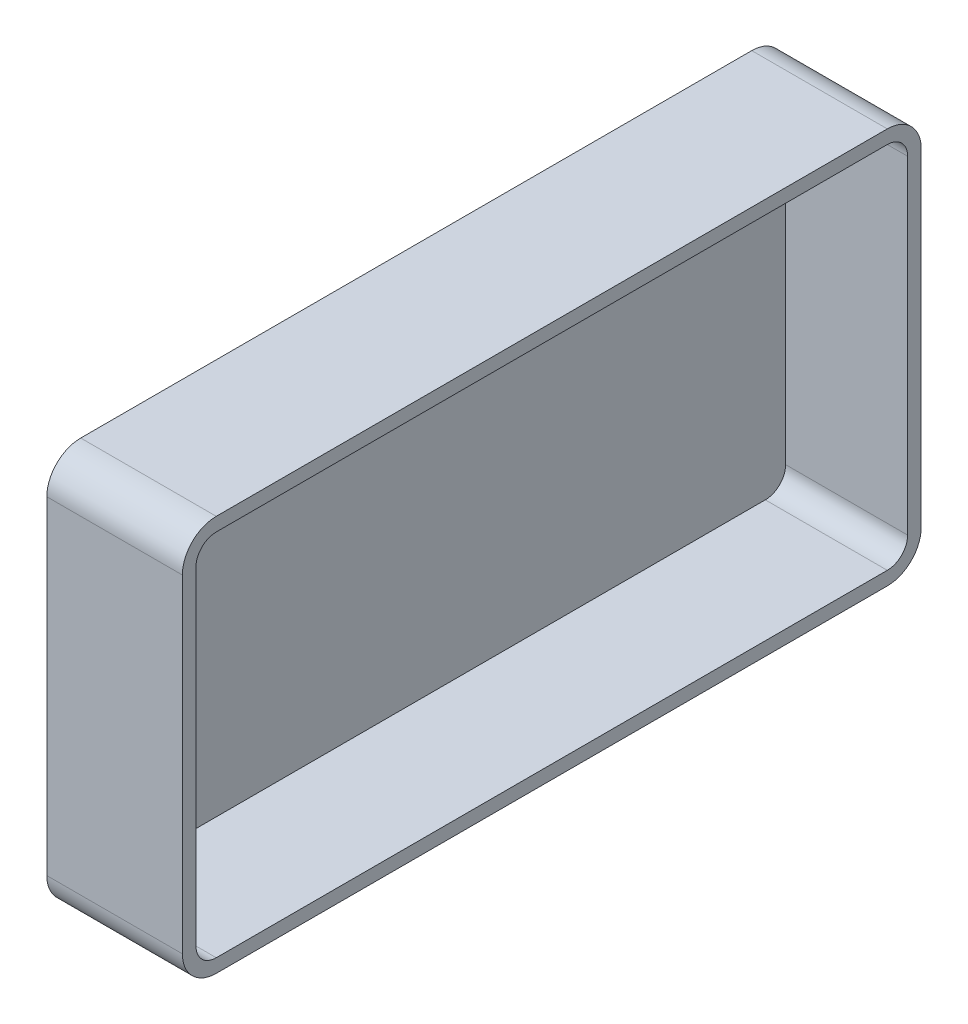
ISO-10303-21;
HEADER;
FILE_DESCRIPTION(('STEP AP214'),'2;1');
FILE_NAME('part.step','',(''),(''),'','','');
FILE_SCHEMA(('AUTOMOTIVE_DESIGN { 1 0 10303 214 1 1 1 1 }'));
ENDSEC;
DATA;
#1=APPLICATION_CONTEXT('core data for automotive mechanical design processes');
#2=APPLICATION_PROTOCOL_DEFINITION('international standard','automotive_design',2000,#1);
#3=PRODUCT_CONTEXT('',#1,'mechanical');
#4=PRODUCT('Part','Part','',(#3));
#5=PRODUCT_RELATED_PRODUCT_CATEGORY('part','',(#4));
#6=PRODUCT_DEFINITION_FORMATION('','',#4);
#7=PRODUCT_DEFINITION_CONTEXT('part definition',#1,'design');
#8=PRODUCT_DEFINITION('design','',#6,#7);
#9=PRODUCT_DEFINITION_SHAPE('','',#8);
#10=(LENGTH_UNIT() NAMED_UNIT(*) SI_UNIT(.MILLI.,.METRE.));
#11=(NAMED_UNIT(*) PLANE_ANGLE_UNIT() SI_UNIT($,.RADIAN.));
#12=(NAMED_UNIT(*) SI_UNIT($,.STERADIAN.) SOLID_ANGLE_UNIT());
#13=UNCERTAINTY_MEASURE_WITH_UNIT(LENGTH_MEASURE(1.E-05),#10,'distance_accuracy_value','');
#14=(GEOMETRIC_REPRESENTATION_CONTEXT(3) GLOBAL_UNCERTAINTY_ASSIGNED_CONTEXT((#13)) GLOBAL_UNIT_ASSIGNED_CONTEXT((#10,
#11,#12)) REPRESENTATION_CONTEXT('',''));
#15=CARTESIAN_POINT('',(0.,0.,0.));
#16=DIRECTION('',(0.,0.,1.));
#17=DIRECTION('',(1.,0.,0.));
#18=AXIS2_PLACEMENT_3D('',#15,#16,#17);
#19=CARTESIAN_POINT('',(20.,-24.2,-49.5));
#20=DIRECTION('',(-1.,0.,0.));
#21=DIRECTION('',(0.,0.,1.));
#22=AXIS2_PLACEMENT_3D('',#19,#20,#21);
#23=CYLINDRICAL_SURFACE('',#22,5.);
#24=CARTESIAN_POINT('',(0.,-24.2,-49.5));
#25=DIRECTION('',(1.,0.,0.));
#26=DIRECTION('',(0.,0.,-1.));
#27=AXIS2_PLACEMENT_3D('',#24,#25,#26);
#28=CIRCLE('',#27,5.);
#29=CARTESIAN_POINT('',(0.,-29.2,-49.5));
#30=VERTEX_POINT('',#29);
#31=CARTESIAN_POINT('',(0.,-24.2,-54.5));
#32=VERTEX_POINT('',#31);
#33=EDGE_CURVE('E145',#30,#32,#28,.T.);
#34=ORIENTED_EDGE('',*,*,#33,.T.);
#35=DIRECTION('',(-1.,0.,0.));
#36=VECTOR('',#35,1.);
#37=CARTESIAN_POINT('',(20.,-24.2,-54.5));
#38=LINE('',#37,#36);
#39=CARTESIAN_POINT('',(20.,-24.2,-54.5));
#40=VERTEX_POINT('',#39);
#41=EDGE_CURVE('E11',#40,#32,#38,.T.);
#42=ORIENTED_EDGE('',*,*,#41,.F.);
#43=CARTESIAN_POINT('',(20.,-24.2,-49.5));
#44=DIRECTION('',(1.,0.,0.));
#45=DIRECTION('',(0.,0.,-1.));
#46=AXIS2_PLACEMENT_3D('',#43,#44,#45);
#47=CIRCLE('',#46,5.);
#48=CARTESIAN_POINT('',(20.,-29.2,-49.5));
#49=VERTEX_POINT('',#48);
#50=EDGE_CURVE('E161',#49,#40,#47,.T.);
#51=ORIENTED_EDGE('',*,*,#50,.F.);
#52=DIRECTION('',(-1.,0.,0.));
#53=VECTOR('',#52,1.);
#54=CARTESIAN_POINT('',(20.,-29.2,-49.5));
#55=LINE('',#54,#53);
#56=EDGE_CURVE('E141',#49,#30,#55,.T.);
#57=ORIENTED_EDGE('',*,*,#56,.T.);
#58=EDGE_LOOP('',(#34,#42,#51,#57));
#59=FACE_BOUND('',#58,.T.);
#60=ADVANCED_FACE('F38',(#59),#23,.T.);
#61=CARTESIAN_POINT('',(20.,-24.2,-54.5));
#62=DIRECTION('',(0.,0.,1.));
#63=DIRECTION('',(1.,0.,0.));
#64=AXIS2_PLACEMENT_3D('',#61,#62,#63);
#65=PLANE('',#64);
#66=DIRECTION('',(0.,1.,0.));
#67=VECTOR('',#66,1.);
#68=CARTESIAN_POINT('',(0.,-24.2,-54.5));
#69=LINE('',#68,#67);
#70=CARTESIAN_POINT('',(0.,24.2,-54.5));
#71=VERTEX_POINT('',#70);
#72=EDGE_CURVE('E148',#32,#71,#69,.T.);
#73=ORIENTED_EDGE('',*,*,#72,.T.);
#74=DIRECTION('',(-1.,0.,0.));
#75=VECTOR('',#74,1.);
#76=CARTESIAN_POINT('',(20.,24.2,-54.5));
#77=LINE('',#76,#75);
#78=CARTESIAN_POINT('',(20.,24.2,-54.5));
#79=VERTEX_POINT('',#78);
#80=EDGE_CURVE('E45',#79,#71,#77,.T.);
#81=ORIENTED_EDGE('',*,*,#80,.F.);
#82=DIRECTION('',(0.,1.,0.));
#83=VECTOR('',#82,1.);
#84=CARTESIAN_POINT('',(20.,-24.2,-54.5));
#85=LINE('',#84,#83);
#86=EDGE_CURVE('E102',#40,#79,#85,.T.);
#87=ORIENTED_EDGE('',*,*,#86,.F.);
#88=ORIENTED_EDGE('',*,*,#41,.T.);
#89=EDGE_LOOP('',(#73,#81,#87,#88));
#90=FACE_BOUND('',#89,.T.);
#91=ADVANCED_FACE('F330',(#90),#65,.F.);
#92=CARTESIAN_POINT('',(20.,24.2,-49.5));
#93=DIRECTION('',(-1.,0.,0.));
#94=DIRECTION('',(0.,0.,1.));
#95=AXIS2_PLACEMENT_3D('',#92,#93,#94);
#96=CYLINDRICAL_SURFACE('',#95,5.);
#97=CARTESIAN_POINT('',(0.,24.2,-49.5));
#98=DIRECTION('',(1.,0.,0.));
#99=DIRECTION('',(0.,0.,1.));
#100=AXIS2_PLACEMENT_3D('',#97,#98,#99);
#101=CIRCLE('',#100,5.);
#102=CARTESIAN_POINT('',(0.,29.2,-49.5));
#103=VERTEX_POINT('',#102);
#104=EDGE_CURVE('E151',#71,#103,#101,.T.);
#105=ORIENTED_EDGE('',*,*,#104,.T.);
#106=DIRECTION('',(-1.,0.,0.));
#107=VECTOR('',#106,1.);
#108=CARTESIAN_POINT('',(20.,29.2,-49.5));
#109=LINE('',#108,#107);
#110=CARTESIAN_POINT('',(20.,29.2,-49.5));
#111=VERTEX_POINT('',#110);
#112=EDGE_CURVE('E168',#111,#103,#109,.T.);
#113=ORIENTED_EDGE('',*,*,#112,.F.);
#114=CARTESIAN_POINT('',(20.,24.2,-49.5));
#115=DIRECTION('',(1.,0.,0.));
#116=DIRECTION('',(0.,0.,1.));
#117=AXIS2_PLACEMENT_3D('',#114,#115,#116);
#118=CIRCLE('',#117,5.);
#119=EDGE_CURVE('E176',#79,#111,#118,.T.);
#120=ORIENTED_EDGE('',*,*,#119,.F.);
#121=ORIENTED_EDGE('',*,*,#80,.T.);
#122=EDGE_LOOP('',(#105,#113,#120,#121));
#123=FACE_BOUND('',#122,.T.);
#124=ADVANCED_FACE('F174',(#123),#96,.T.);
#125=CARTESIAN_POINT('',(20.,29.2,49.5));
#126=DIRECTION('',(0.,-1.,0.));
#127=DIRECTION('',(0.,0.,-1.));
#128=AXIS2_PLACEMENT_3D('',#125,#126,#127);
#129=PLANE('',#128);
#130=DIRECTION('',(0.,0.,1.));
#131=VECTOR('',#130,1.);
#132=CARTESIAN_POINT('',(0.,29.2,49.5));
#133=LINE('',#132,#131);
#134=CARTESIAN_POINT('',(0.,29.2,49.5));
#135=VERTEX_POINT('',#134);
#136=EDGE_CURVE('E153',#103,#135,#133,.T.);
#137=ORIENTED_EDGE('',*,*,#136,.T.);
#138=DIRECTION('',(-1.,0.,0.));
#139=VECTOR('',#138,1.);
#140=CARTESIAN_POINT('',(20.,29.2,49.5));
#141=LINE('',#140,#139);
#142=CARTESIAN_POINT('',(20.,29.2,49.5));
#143=VERTEX_POINT('',#142);
#144=EDGE_CURVE('E165',#143,#135,#141,.T.);
#145=ORIENTED_EDGE('',*,*,#144,.F.);
#146=DIRECTION('',(0.,0.,1.));
#147=VECTOR('',#146,1.);
#148=CARTESIAN_POINT('',(20.,29.2,49.5));
#149=LINE('',#148,#147);
#150=EDGE_CURVE('E188',#111,#143,#149,.T.);
#151=ORIENTED_EDGE('',*,*,#150,.F.);
#152=ORIENTED_EDGE('',*,*,#112,.T.);
#153=EDGE_LOOP('',(#137,#145,#151,#152));
#154=FACE_BOUND('',#153,.T.);
#155=ADVANCED_FACE('F184',(#154),#129,.F.);
#156=CARTESIAN_POINT('',(20.,24.2,49.5));
#157=DIRECTION('',(-1.,0.,0.));
#158=DIRECTION('',(0.,0.,1.));
#159=AXIS2_PLACEMENT_3D('',#156,#157,#158);
#160=CYLINDRICAL_SURFACE('',#159,5.);
#161=CARTESIAN_POINT('',(0.,24.2,49.5));
#162=DIRECTION('',(1.,0.,0.));
#163=DIRECTION('',(0.,0.,1.));
#164=AXIS2_PLACEMENT_3D('',#161,#162,#163);
#165=CIRCLE('',#164,5.);
#166=CARTESIAN_POINT('',(0.,24.2,54.5));
#167=VERTEX_POINT('',#166);
#168=EDGE_CURVE('E155',#135,#167,#165,.T.);
#169=ORIENTED_EDGE('',*,*,#168,.T.);
#170=DIRECTION('',(-1.,0.,0.));
#171=VECTOR('',#170,1.);
#172=CARTESIAN_POINT('',(20.,24.2,54.5));
#173=LINE('',#172,#171);
#174=CARTESIAN_POINT('',(20.,24.2,54.5));
#175=VERTEX_POINT('',#174);
#176=EDGE_CURVE('E136',#175,#167,#173,.T.);
#177=ORIENTED_EDGE('',*,*,#176,.F.);
#178=CARTESIAN_POINT('',(20.,24.2,49.5));
#179=DIRECTION('',(1.,0.,0.));
#180=DIRECTION('',(0.,0.,1.));
#181=AXIS2_PLACEMENT_3D('',#178,#179,#180);
#182=CIRCLE('',#181,5.);
#183=EDGE_CURVE('E124',#143,#175,#182,.T.);
#184=ORIENTED_EDGE('',*,*,#183,.F.);
#185=ORIENTED_EDGE('',*,*,#144,.T.);
#186=EDGE_LOOP('',(#169,#177,#184,#185));
#187=FACE_BOUND('',#186,.T.);
#188=ADVANCED_FACE('F187',(#187),#160,.T.);
#189=CARTESIAN_POINT('',(20.,-24.2,54.5));
#190=DIRECTION('',(0.,0.,-1.));
#191=DIRECTION('',(-1.,0.,0.));
#192=AXIS2_PLACEMENT_3D('',#189,#190,#191);
#193=PLANE('',#192);
#194=DIRECTION('',(0.,-1.,0.));
#195=VECTOR('',#194,1.);
#196=CARTESIAN_POINT('',(0.,-24.2,54.5));
#197=LINE('',#196,#195);
#198=CARTESIAN_POINT('',(0.,-24.2,54.5));
#199=VERTEX_POINT('',#198);
#200=EDGE_CURVE('E133',#167,#199,#197,.T.);
#201=ORIENTED_EDGE('',*,*,#200,.T.);
#202=DIRECTION('',(-1.,0.,0.));
#203=VECTOR('',#202,1.);
#204=CARTESIAN_POINT('',(20.,-24.2,54.5));
#205=LINE('',#204,#203);
#206=CARTESIAN_POINT('',(20.,-24.2,54.5));
#207=VERTEX_POINT('',#206);
#208=EDGE_CURVE('E130',#207,#199,#205,.T.);
#209=ORIENTED_EDGE('',*,*,#208,.F.);
#210=DIRECTION('',(0.,-1.,0.));
#211=VECTOR('',#210,1.);
#212=CARTESIAN_POINT('',(20.,-24.2,54.5));
#213=LINE('',#212,#211);
#214=EDGE_CURVE('E117',#175,#207,#213,.T.);
#215=ORIENTED_EDGE('',*,*,#214,.F.);
#216=ORIENTED_EDGE('',*,*,#176,.T.);
#217=EDGE_LOOP('',(#201,#209,#215,#216));
#218=FACE_BOUND('',#217,.T.);
#219=ADVANCED_FACE('F131',(#218),#193,.F.);
#220=CARTESIAN_POINT('',(20.,-24.2,49.5));
#221=DIRECTION('',(-1.,0.,0.));
#222=DIRECTION('',(0.,0.,1.));
#223=AXIS2_PLACEMENT_3D('',#220,#221,#222);
#224=CYLINDRICAL_SURFACE('',#223,5.);
#225=CARTESIAN_POINT('',(0.,-24.2,49.5));
#226=DIRECTION('',(1.,0.,0.));
#227=DIRECTION('',(0.,0.,1.));
#228=AXIS2_PLACEMENT_3D('',#225,#226,#227);
#229=CIRCLE('',#228,5.);
#230=CARTESIAN_POINT('',(0.,-29.2,49.5));
#231=VERTEX_POINT('',#230);
#232=EDGE_CURVE('E158',#199,#231,#229,.T.);
#233=ORIENTED_EDGE('',*,*,#232,.T.);
#234=DIRECTION('',(-1.,0.,0.));
#235=VECTOR('',#234,1.);
#236=CARTESIAN_POINT('',(20.,-29.2,49.5));
#237=LINE('',#236,#235);
#238=CARTESIAN_POINT('',(20.,-29.2,49.5));
#239=VERTEX_POINT('',#238);
#240=EDGE_CURVE('E137',#239,#231,#237,.T.);
#241=ORIENTED_EDGE('',*,*,#240,.F.);
#242=CARTESIAN_POINT('',(20.,-24.2,49.5));
#243=DIRECTION('',(1.,0.,0.));
#244=DIRECTION('',(0.,0.,1.));
#245=AXIS2_PLACEMENT_3D('',#242,#243,#244);
#246=CIRCLE('',#245,5.);
#247=EDGE_CURVE('E121',#207,#239,#246,.T.);
#248=ORIENTED_EDGE('',*,*,#247,.F.);
#249=ORIENTED_EDGE('',*,*,#208,.T.);
#250=EDGE_LOOP('',(#233,#241,#248,#249));
#251=FACE_BOUND('',#250,.T.);
#252=ADVANCED_FACE('F139',(#251),#224,.T.);
#253=CARTESIAN_POINT('',(20.,-29.2,49.5));
#254=DIRECTION('',(0.,1.,0.));
#255=DIRECTION('',(0.,0.,1.));
#256=AXIS2_PLACEMENT_3D('',#253,#254,#255);
#257=PLANE('',#256);
#258=DIRECTION('',(0.,0.,-1.));
#259=VECTOR('',#258,1.);
#260=CARTESIAN_POINT('',(0.,-29.2,49.5));
#261=LINE('',#260,#259);
#262=EDGE_CURVE('E94',#231,#30,#261,.T.);
#263=ORIENTED_EDGE('',*,*,#262,.T.);
#264=ORIENTED_EDGE('',*,*,#56,.F.);
#265=DIRECTION('',(0.,0.,-1.));
#266=VECTOR('',#265,1.);
#267=CARTESIAN_POINT('',(20.,-29.2,49.5));
#268=LINE('',#267,#266);
#269=EDGE_CURVE('E61',#239,#49,#268,.T.);
#270=ORIENTED_EDGE('',*,*,#269,.F.);
#271=ORIENTED_EDGE('',*,*,#240,.T.);
#272=EDGE_LOOP('',(#263,#264,#270,#271));
#273=FACE_BOUND('',#272,.T.);
#274=ADVANCED_FACE('F337',(#273),#257,.F.);
#275=CARTESIAN_POINT('',(20.,-24.2,-49.5));
#276=DIRECTION('',(1.,0.,0.));
#277=DIRECTION('',(0.,0.,-1.));
#278=AXIS2_PLACEMENT_3D('',#275,#276,#277);
#279=PLANE('',#278);
#280=CARTESIAN_POINT('',(20.,-24.2,-49.5));
#281=DIRECTION('',(1.,0.,0.));
#282=DIRECTION('',(0.,0.,-1.));
#283=AXIS2_PLACEMENT_3D('',#280,#281,#282);
#284=CIRCLE('',#283,3.);
#285=CARTESIAN_POINT('',(20.,-27.2,-49.5));
#286=VERTEX_POINT('',#285);
#287=CARTESIAN_POINT('',(20.,-24.2,-52.5));
#288=VERTEX_POINT('',#287);
#289=EDGE_CURVE('E214',#286,#288,#284,.T.);
#290=ORIENTED_EDGE('',*,*,#289,.F.);
#291=DIRECTION('',(0.,0.,-1.));
#292=VECTOR('',#291,1.);
#293=CARTESIAN_POINT('',(20.,-27.2,49.5));
#294=LINE('',#293,#292);
#295=CARTESIAN_POINT('',(20.,-27.2,49.5));
#296=VERTEX_POINT('',#295);
#297=EDGE_CURVE('E194',#296,#286,#294,.T.);
#298=ORIENTED_EDGE('',*,*,#297,.F.);
#299=CARTESIAN_POINT('',(20.,-24.2,49.5));
#300=DIRECTION('',(1.,0.,0.));
#301=DIRECTION('',(0.,0.,-1.));
#302=AXIS2_PLACEMENT_3D('',#299,#300,#301);
#303=CIRCLE('',#302,3.);
#304=CARTESIAN_POINT('',(20.,-24.2,52.5));
#305=VERTEX_POINT('',#304);
#306=EDGE_CURVE('E197',#305,#296,#303,.T.);
#307=ORIENTED_EDGE('',*,*,#306,.F.);
#308=DIRECTION('',(0.,-1.,0.));
#309=VECTOR('',#308,1.);
#310=CARTESIAN_POINT('',(20.,-24.2,52.5));
#311=LINE('',#310,#309);
#312=CARTESIAN_POINT('',(20.,24.2,52.5));
#313=VERTEX_POINT('',#312);
#314=EDGE_CURVE('E199',#313,#305,#311,.T.);
#315=ORIENTED_EDGE('',*,*,#314,.F.);
#316=CARTESIAN_POINT('',(20.,24.2,49.5));
#317=DIRECTION('',(1.,0.,0.));
#318=DIRECTION('',(0.,0.,-1.));
#319=AXIS2_PLACEMENT_3D('',#316,#317,#318);
#320=CIRCLE('',#319,3.);
#321=CARTESIAN_POINT('',(20.,27.2,49.5));
#322=VERTEX_POINT('',#321);
#323=EDGE_CURVE('E202',#322,#313,#320,.T.);
#324=ORIENTED_EDGE('',*,*,#323,.F.);
#325=DIRECTION('',(0.,0.,1.));
#326=VECTOR('',#325,1.);
#327=CARTESIAN_POINT('',(20.,27.2,49.5));
#328=LINE('',#327,#326);
#329=CARTESIAN_POINT('',(20.,27.2,-49.5));
#330=VERTEX_POINT('',#329);
#331=EDGE_CURVE('E205',#330,#322,#328,.T.);
#332=ORIENTED_EDGE('',*,*,#331,.F.);
#333=CARTESIAN_POINT('',(20.,24.2,-49.5));
#334=DIRECTION('',(1.,0.,0.));
#335=DIRECTION('',(0.,0.,-1.));
#336=AXIS2_PLACEMENT_3D('',#333,#334,#335);
#337=CIRCLE('',#336,3.);
#338=CARTESIAN_POINT('',(20.,24.2,-52.5));
#339=VERTEX_POINT('',#338);
#340=EDGE_CURVE('E208',#339,#330,#337,.T.);
#341=ORIENTED_EDGE('',*,*,#340,.F.);
#342=DIRECTION('',(0.,1.,0.));
#343=VECTOR('',#342,1.);
#344=CARTESIAN_POINT('',(20.,-24.2,-52.5));
#345=LINE('',#344,#343);
#346=EDGE_CURVE('E211',#288,#339,#345,.T.);
#347=ORIENTED_EDGE('',*,*,#346,.F.);
#348=EDGE_LOOP('',(#290,#298,#307,#315,#324,#332,#341,#347));
#349=FACE_BOUND('',#348,.T.);
#350=ORIENTED_EDGE('',*,*,#50,.T.);
#351=ORIENTED_EDGE('',*,*,#86,.T.);
#352=ORIENTED_EDGE('',*,*,#119,.T.);
#353=ORIENTED_EDGE('',*,*,#150,.T.);
#354=ORIENTED_EDGE('',*,*,#183,.T.);
#355=ORIENTED_EDGE('',*,*,#214,.T.);
#356=ORIENTED_EDGE('',*,*,#247,.T.);
#357=ORIENTED_EDGE('',*,*,#269,.T.);
#358=EDGE_LOOP('',(#350,#351,#352,#353,#354,#355,#356,#357));
#359=FACE_BOUND('',#358,.T.);
#360=ADVANCED_FACE('F119',(#349,#359),#279,.T.);
#361=CARTESIAN_POINT('',(0.,-24.2,-49.5));
#362=DIRECTION('',(1.,0.,0.));
#363=DIRECTION('',(0.,0.,-1.));
#364=AXIS2_PLACEMENT_3D('',#361,#362,#363);
#365=PLANE('',#364);
#366=ORIENTED_EDGE('',*,*,#33,.F.);
#367=ORIENTED_EDGE('',*,*,#262,.F.);
#368=ORIENTED_EDGE('',*,*,#232,.F.);
#369=ORIENTED_EDGE('',*,*,#200,.F.);
#370=ORIENTED_EDGE('',*,*,#168,.F.);
#371=ORIENTED_EDGE('',*,*,#136,.F.);
#372=ORIENTED_EDGE('',*,*,#104,.F.);
#373=ORIENTED_EDGE('',*,*,#72,.F.);
#374=EDGE_LOOP('',(#366,#367,#368,#369,#370,#371,#372,#373));
#375=FACE_BOUND('',#374,.T.);
#376=ADVANCED_FACE('F180',(#375),#365,.F.);
#377=CARTESIAN_POINT('',(20.,-24.2,-49.5));
#378=DIRECTION('',(-1.,0.,0.));
#379=DIRECTION('',(0.,0.,1.));
#380=AXIS2_PLACEMENT_3D('',#377,#378,#379);
#381=CYLINDRICAL_SURFACE('',#380,3.);
#382=CARTESIAN_POINT('',(2.,-24.2,-49.5));
#383=DIRECTION('',(1.,0.,0.));
#384=DIRECTION('',(0.,0.,-1.));
#385=AXIS2_PLACEMENT_3D('',#382,#383,#384);
#386=CIRCLE('',#385,3.);
#387=CARTESIAN_POINT('',(2.,-27.2,-49.5));
#388=VERTEX_POINT('',#387);
#389=CARTESIAN_POINT('',(2.,-24.2,-52.5));
#390=VERTEX_POINT('',#389);
#391=EDGE_CURVE('E254',#388,#390,#386,.T.);
#392=ORIENTED_EDGE('',*,*,#391,.F.);
#393=DIRECTION('',(-1.,0.,0.));
#394=VECTOR('',#393,1.);
#395=CARTESIAN_POINT('',(20.,-27.2,-49.5));
#396=LINE('',#395,#394);
#397=EDGE_CURVE('E196',#286,#388,#396,.T.);
#398=ORIENTED_EDGE('',*,*,#397,.F.);
#399=ORIENTED_EDGE('',*,*,#289,.T.);
#400=DIRECTION('',(1.,0.,0.));
#401=VECTOR('',#400,1.);
#402=CARTESIAN_POINT('',(20.,-24.2,-52.5));
#403=LINE('',#402,#401);
#404=EDGE_CURVE('E149',#288,#390,#403,.F.);
#405=ORIENTED_EDGE('',*,*,#404,.T.);
#406=EDGE_LOOP('',(#392,#398,#399,#405));
#407=FACE_BOUND('',#406,.T.);
#408=ADVANCED_FACE('F270',(#407),#381,.F.);
#409=CARTESIAN_POINT('',(20.,-24.2,-52.5));
#410=DIRECTION('',(0.,0.,1.));
#411=DIRECTION('',(1.,0.,0.));
#412=AXIS2_PLACEMENT_3D('',#409,#410,#411);
#413=PLANE('',#412);
#414=DIRECTION('',(0.,1.,0.));
#415=VECTOR('',#414,1.);
#416=CARTESIAN_POINT('',(2.,-24.2,-52.5));
#417=LINE('',#416,#415);
#418=CARTESIAN_POINT('',(2.,24.2,-52.5));
#419=VERTEX_POINT('',#418);
#420=EDGE_CURVE('E249',#390,#419,#417,.T.);
#421=ORIENTED_EDGE('',*,*,#420,.F.);
#422=ORIENTED_EDGE('',*,*,#404,.F.);
#423=ORIENTED_EDGE('',*,*,#346,.T.);
#424=DIRECTION('',(-1.,0.,0.));
#425=VECTOR('',#424,1.);
#426=CARTESIAN_POINT('',(20.,24.2,-52.5));
#427=LINE('',#426,#425);
#428=EDGE_CURVE('E246',#339,#419,#427,.T.);
#429=ORIENTED_EDGE('',*,*,#428,.T.);
#430=EDGE_LOOP('',(#421,#422,#423,#429));
#431=FACE_BOUND('',#430,.T.);
#432=ADVANCED_FACE('F300',(#431),#413,.T.);
#433=CARTESIAN_POINT('',(20.,24.2,-49.5));
#434=DIRECTION('',(-1.,0.,0.));
#435=DIRECTION('',(0.,0.,1.));
#436=AXIS2_PLACEMENT_3D('',#433,#434,#435);
#437=CYLINDRICAL_SURFACE('',#436,3.);
#438=CARTESIAN_POINT('',(2.,24.2,-49.5));
#439=DIRECTION('',(1.,0.,0.));
#440=DIRECTION('',(0.,0.,-1.));
#441=AXIS2_PLACEMENT_3D('',#438,#439,#440);
#442=CIRCLE('',#441,3.);
#443=CARTESIAN_POINT('',(2.,27.2,-49.5));
#444=VERTEX_POINT('',#443);
#445=EDGE_CURVE('E243',#419,#444,#442,.T.);
#446=ORIENTED_EDGE('',*,*,#445,.F.);
#447=ORIENTED_EDGE('',*,*,#428,.F.);
#448=ORIENTED_EDGE('',*,*,#340,.T.);
#449=DIRECTION('',(1.,0.,0.));
#450=VECTOR('',#449,1.);
#451=CARTESIAN_POINT('',(20.,27.2,-49.5));
#452=LINE('',#451,#450);
#453=EDGE_CURVE('E240',#330,#444,#452,.F.);
#454=ORIENTED_EDGE('',*,*,#453,.T.);
#455=EDGE_LOOP('',(#446,#447,#448,#454));
#456=FACE_BOUND('',#455,.T.);
#457=ADVANCED_FACE('F306',(#456),#437,.F.);
#458=CARTESIAN_POINT('',(20.,27.2,49.5));
#459=DIRECTION('',(0.,-1.,0.));
#460=DIRECTION('',(0.,0.,-1.));
#461=AXIS2_PLACEMENT_3D('',#458,#459,#460);
#462=PLANE('',#461);
#463=DIRECTION('',(0.,0.,1.));
#464=VECTOR('',#463,1.);
#465=CARTESIAN_POINT('',(2.,27.2,49.5));
#466=LINE('',#465,#464);
#467=CARTESIAN_POINT('',(2.,27.2,49.5));
#468=VERTEX_POINT('',#467);
#469=EDGE_CURVE('E237',#444,#468,#466,.T.);
#470=ORIENTED_EDGE('',*,*,#469,.F.);
#471=ORIENTED_EDGE('',*,*,#453,.F.);
#472=ORIENTED_EDGE('',*,*,#331,.T.);
#473=DIRECTION('',(-1.,0.,0.));
#474=VECTOR('',#473,1.);
#475=CARTESIAN_POINT('',(20.,27.2,49.5));
#476=LINE('',#475,#474);
#477=EDGE_CURVE('E234',#322,#468,#476,.T.);
#478=ORIENTED_EDGE('',*,*,#477,.T.);
#479=EDGE_LOOP('',(#470,#471,#472,#478));
#480=FACE_BOUND('',#479,.T.);
#481=ADVANCED_FACE('F422',(#480),#462,.T.);
#482=CARTESIAN_POINT('',(20.,24.2,49.5));
#483=DIRECTION('',(-1.,0.,0.));
#484=DIRECTION('',(0.,0.,1.));
#485=AXIS2_PLACEMENT_3D('',#482,#483,#484);
#486=CYLINDRICAL_SURFACE('',#485,3.);
#487=CARTESIAN_POINT('',(2.,24.2,49.5));
#488=DIRECTION('',(1.,0.,0.));
#489=DIRECTION('',(0.,0.,-1.));
#490=AXIS2_PLACEMENT_3D('',#487,#488,#489);
#491=CIRCLE('',#490,3.);
#492=CARTESIAN_POINT('',(2.,24.2,52.5));
#493=VERTEX_POINT('',#492);
#494=EDGE_CURVE('E231',#468,#493,#491,.T.);
#495=ORIENTED_EDGE('',*,*,#494,.F.);
#496=ORIENTED_EDGE('',*,*,#477,.F.);
#497=ORIENTED_EDGE('',*,*,#323,.T.);
#498=DIRECTION('',(-1.,0.,0.));
#499=VECTOR('',#498,1.);
#500=CARTESIAN_POINT('',(20.,24.2,52.5));
#501=LINE('',#500,#499);
#502=EDGE_CURVE('E228',#313,#493,#501,.T.);
#503=ORIENTED_EDGE('',*,*,#502,.T.);
#504=EDGE_LOOP('',(#495,#496,#497,#503));
#505=FACE_BOUND('',#504,.T.);
#506=ADVANCED_FACE('F327',(#505),#486,.F.);
#507=CARTESIAN_POINT('',(20.,-24.2,52.5));
#508=DIRECTION('',(0.,0.,-1.));
#509=DIRECTION('',(-1.,0.,0.));
#510=AXIS2_PLACEMENT_3D('',#507,#508,#509);
#511=PLANE('',#510);
#512=DIRECTION('',(0.,-1.,0.));
#513=VECTOR('',#512,1.);
#514=CARTESIAN_POINT('',(2.,-24.2,52.5));
#515=LINE('',#514,#513);
#516=CARTESIAN_POINT('',(2.,-24.2,52.5));
#517=VERTEX_POINT('',#516);
#518=EDGE_CURVE('E225',#493,#517,#515,.T.);
#519=ORIENTED_EDGE('',*,*,#518,.F.);
#520=ORIENTED_EDGE('',*,*,#502,.F.);
#521=ORIENTED_EDGE('',*,*,#314,.T.);
#522=DIRECTION('',(-1.,0.,0.));
#523=VECTOR('',#522,1.);
#524=CARTESIAN_POINT('',(20.,-24.2,52.5));
#525=LINE('',#524,#523);
#526=EDGE_CURVE('E222',#305,#517,#525,.T.);
#527=ORIENTED_EDGE('',*,*,#526,.T.);
#528=EDGE_LOOP('',(#519,#520,#521,#527));
#529=FACE_BOUND('',#528,.T.);
#530=ADVANCED_FACE('F317',(#529),#511,.T.);
#531=CARTESIAN_POINT('',(20.,-24.2,49.5));
#532=DIRECTION('',(-1.,0.,0.));
#533=DIRECTION('',(0.,0.,1.));
#534=AXIS2_PLACEMENT_3D('',#531,#532,#533);
#535=CYLINDRICAL_SURFACE('',#534,3.);
#536=CARTESIAN_POINT('',(2.,-24.2,49.5));
#537=DIRECTION('',(1.,0.,0.));
#538=DIRECTION('',(0.,0.,-1.));
#539=AXIS2_PLACEMENT_3D('',#536,#537,#538);
#540=CIRCLE('',#539,3.);
#541=CARTESIAN_POINT('',(2.,-27.2,49.5));
#542=VERTEX_POINT('',#541);
#543=EDGE_CURVE('E220',#517,#542,#540,.T.);
#544=ORIENTED_EDGE('',*,*,#543,.F.);
#545=ORIENTED_EDGE('',*,*,#526,.F.);
#546=ORIENTED_EDGE('',*,*,#306,.T.);
#547=DIRECTION('',(1.,0.,0.));
#548=VECTOR('',#547,1.);
#549=CARTESIAN_POINT('',(20.,-27.2,49.5));
#550=LINE('',#549,#548);
#551=EDGE_CURVE('E52',#296,#542,#550,.F.);
#552=ORIENTED_EDGE('',*,*,#551,.T.);
#553=EDGE_LOOP('',(#544,#545,#546,#552));
#554=FACE_BOUND('',#553,.T.);
#555=ADVANCED_FACE('F319',(#554),#535,.F.);
#556=CARTESIAN_POINT('',(20.,-27.2,49.5));
#557=DIRECTION('',(0.,1.,0.));
#558=DIRECTION('',(0.,0.,1.));
#559=AXIS2_PLACEMENT_3D('',#556,#557,#558);
#560=PLANE('',#559);
#561=DIRECTION('',(0.,0.,-1.));
#562=VECTOR('',#561,1.);
#563=CARTESIAN_POINT('',(2.,-27.2,49.5));
#564=LINE('',#563,#562);
#565=EDGE_CURVE('E217',#542,#388,#564,.T.);
#566=ORIENTED_EDGE('',*,*,#565,.F.);
#567=ORIENTED_EDGE('',*,*,#551,.F.);
#568=ORIENTED_EDGE('',*,*,#297,.T.);
#569=ORIENTED_EDGE('',*,*,#397,.T.);
#570=EDGE_LOOP('',(#566,#567,#568,#569));
#571=FACE_BOUND('',#570,.T.);
#572=ADVANCED_FACE('F294',(#571),#560,.T.);
#573=CARTESIAN_POINT('',(2.,-24.2,-49.5));
#574=DIRECTION('',(1.,0.,0.));
#575=DIRECTION('',(0.,0.,-1.));
#576=AXIS2_PLACEMENT_3D('',#573,#574,#575);
#577=PLANE('',#576);
#578=ORIENTED_EDGE('',*,*,#391,.T.);
#579=ORIENTED_EDGE('',*,*,#420,.T.);
#580=ORIENTED_EDGE('',*,*,#445,.T.);
#581=ORIENTED_EDGE('',*,*,#469,.T.);
#582=ORIENTED_EDGE('',*,*,#494,.T.);
#583=ORIENTED_EDGE('',*,*,#518,.T.);
#584=ORIENTED_EDGE('',*,*,#543,.T.);
#585=ORIENTED_EDGE('',*,*,#565,.T.);
#586=EDGE_LOOP('',(#578,#579,#580,#581,#582,#583,#584,#585));
#587=FACE_BOUND('',#586,.T.);
#588=ADVANCED_FACE('F263',(#587),#577,.T.);
#589=CLOSED_SHELL('',(#60,#91,#124,#155,#188,#219,#252,#274,#360,#376,#408,#432,#457,#481,#506,
#530,#555,#572,#588));
#590=MANIFOLD_SOLID_BREP('B2',#589);
#591=ADVANCED_BREP_SHAPE_REPRESENTATION('',(#18,#590),#14);
#592=SHAPE_DEFINITION_REPRESENTATION(#9,#591);
ENDSEC;
END-ISO-10303-21;
